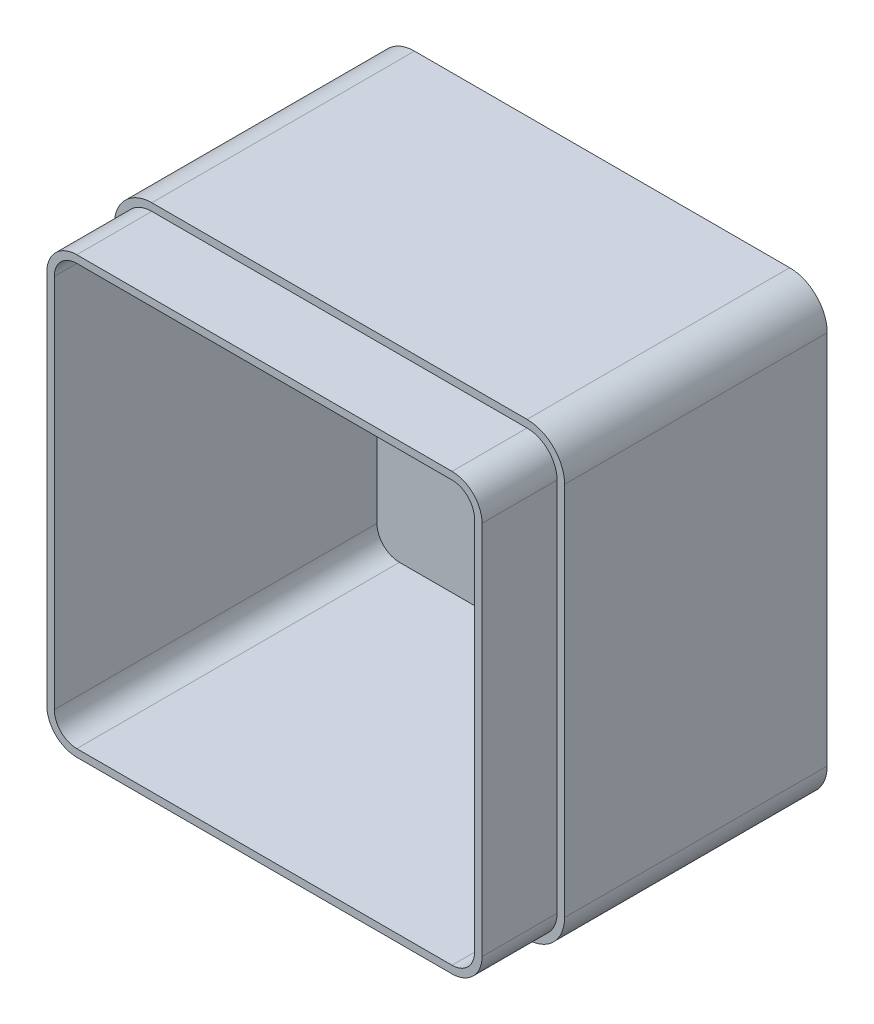
ISO-10303-21;
HEADER;
FILE_DESCRIPTION(('STEP AP214'),'2;1');
FILE_NAME('part.step','',(''),(''),'','','');
FILE_SCHEMA(('AUTOMOTIVE_DESIGN { 1 0 10303 214 1 1 1 1 }'));
ENDSEC;
DATA;
#1=APPLICATION_CONTEXT('core data for automotive mechanical design processes');
#2=APPLICATION_PROTOCOL_DEFINITION('international standard','automotive_design',2000,#1);
#3=PRODUCT_CONTEXT('',#1,'mechanical');
#4=PRODUCT('Part','Part','',(#3));
#5=PRODUCT_RELATED_PRODUCT_CATEGORY('part','',(#4));
#6=PRODUCT_DEFINITION_FORMATION('','',#4);
#7=PRODUCT_DEFINITION_CONTEXT('part definition',#1,'design');
#8=PRODUCT_DEFINITION('design','',#6,#7);
#9=PRODUCT_DEFINITION_SHAPE('','',#8);
#10=(LENGTH_UNIT() NAMED_UNIT(*) SI_UNIT(.MILLI.,.METRE.));
#11=(NAMED_UNIT(*) PLANE_ANGLE_UNIT() SI_UNIT($,.RADIAN.));
#12=(NAMED_UNIT(*) SI_UNIT($,.STERADIAN.) SOLID_ANGLE_UNIT());
#13=UNCERTAINTY_MEASURE_WITH_UNIT(LENGTH_MEASURE(1.E-05),#10,'distance_accuracy_value','');
#14=(GEOMETRIC_REPRESENTATION_CONTEXT(3) GLOBAL_UNCERTAINTY_ASSIGNED_CONTEXT((#13)) GLOBAL_UNIT_ASSIGNED_CONTEXT((#10,
#11,#12)) REPRESENTATION_CONTEXT('',''));
#15=CARTESIAN_POINT('',(0.,0.,0.));
#16=DIRECTION('',(0.,0.,1.));
#17=DIRECTION('',(1.,0.,0.));
#18=AXIS2_PLACEMENT_3D('',#15,#16,#17);
#19=CARTESIAN_POINT('',(0.,0.,90.));
#20=DIRECTION('',(0.,0.,-1.));
#21=DIRECTION('',(-1.,0.,0.));
#22=AXIS2_PLACEMENT_3D('',#19,#20,#21);
#23=PLANE('',#22);
#24=DIRECTION('',(-1.,0.,0.));
#25=VECTOR('',#24,1.);
#26=CARTESIAN_POINT('',(0.,56.,90.));
#27=LINE('',#26,#25);
#28=CARTESIAN_POINT('',(50.,56.,90.));
#29=VERTEX_POINT('',#28);
#30=CARTESIAN_POINT('',(-50.,56.,90.));
#31=VERTEX_POINT('',#30);
#32=EDGE_CURVE('E377',#29,#31,#27,.T.);
#33=ORIENTED_EDGE('',*,*,#32,.F.);
#34=CARTESIAN_POINT('',(50.,50.,90.));
#35=DIRECTION('',(0.,0.,-1.));
#36=DIRECTION('',(-1.,0.,0.));
#37=AXIS2_PLACEMENT_3D('',#34,#35,#36);
#38=CIRCLE('',#37,6.);
#39=CARTESIAN_POINT('',(56.,50.,90.));
#40=VERTEX_POINT('',#39);
#41=EDGE_CURVE('E357',#40,#29,#38,.F.);
#42=ORIENTED_EDGE('',*,*,#41,.F.);
#43=DIRECTION('',(0.,1.,0.));
#44=VECTOR('',#43,1.);
#45=CARTESIAN_POINT('',(56.,0.,90.));
#46=LINE('',#45,#44);
#47=CARTESIAN_POINT('',(56.,-50.,90.));
#48=VERTEX_POINT('',#47);
#49=EDGE_CURVE('E351',#48,#40,#46,.T.);
#50=ORIENTED_EDGE('',*,*,#49,.F.);
#51=CARTESIAN_POINT('',(50.,-50.,90.));
#52=DIRECTION('',(0.,0.,-1.));
#53=DIRECTION('',(-1.,0.,0.));
#54=AXIS2_PLACEMENT_3D('',#51,#52,#53);
#55=CIRCLE('',#54,6.);
#56=CARTESIAN_POINT('',(50.,-56.,90.));
#57=VERTEX_POINT('',#56);
#58=EDGE_CURVE('E380',#57,#48,#55,.F.);
#59=ORIENTED_EDGE('',*,*,#58,.F.);
#60=DIRECTION('',(1.,0.,0.));
#61=VECTOR('',#60,1.);
#62=CARTESIAN_POINT('',(0.,-56.,90.));
#63=LINE('',#62,#61);
#64=CARTESIAN_POINT('',(-50.,-56.,90.));
#65=VERTEX_POINT('',#64);
#66=EDGE_CURVE('E367',#65,#57,#63,.T.);
#67=ORIENTED_EDGE('',*,*,#66,.F.);
#68=CARTESIAN_POINT('',(-50.,-50.,90.));
#69=DIRECTION('',(0.,0.,-1.));
#70=DIRECTION('',(-1.,0.,0.));
#71=AXIS2_PLACEMENT_3D('',#68,#69,#70);
#72=CIRCLE('',#71,6.);
#73=CARTESIAN_POINT('',(-56.,-50.,90.));
#74=VERTEX_POINT('',#73);
#75=EDGE_CURVE('E387',#74,#65,#72,.F.);
#76=ORIENTED_EDGE('',*,*,#75,.F.);
#77=DIRECTION('',(0.,-1.,0.));
#78=VECTOR('',#77,1.);
#79=CARTESIAN_POINT('',(-56.,0.,90.));
#80=LINE('',#79,#78);
#81=CARTESIAN_POINT('',(-56.,50.,90.));
#82=VERTEX_POINT('',#81);
#83=EDGE_CURVE('E384',#82,#74,#80,.T.);
#84=ORIENTED_EDGE('',*,*,#83,.F.);
#85=CARTESIAN_POINT('',(-50.,50.,90.));
#86=DIRECTION('',(0.,0.,-1.));
#87=DIRECTION('',(-1.,0.,0.));
#88=AXIS2_PLACEMENT_3D('',#85,#86,#87);
#89=CIRCLE('',#88,6.);
#90=EDGE_CURVE('E374',#31,#82,#89,.F.);
#91=ORIENTED_EDGE('',*,*,#90,.F.);
#92=EDGE_LOOP('',(#33,#42,#50,#59,#67,#76,#84,#91));
#93=FACE_BOUND('',#92,.T.);
#94=CARTESIAN_POINT('',(50.,50.,90.));
#95=DIRECTION('',(0.,0.,1.));
#96=DIRECTION('',(1.,0.,0.));
#97=AXIS2_PLACEMENT_3D('',#94,#95,#96);
#98=CIRCLE('',#97,8.);
#99=CARTESIAN_POINT('',(58.,50.,90.));
#100=VERTEX_POINT('',#99);
#101=CARTESIAN_POINT('',(50.,58.,90.));
#102=VERTEX_POINT('',#101);
#103=EDGE_CURVE('E54',#100,#102,#98,.T.);
#104=ORIENTED_EDGE('',*,*,#103,.T.);
#105=DIRECTION('',(-1.,0.,0.));
#106=VECTOR('',#105,1.);
#107=CARTESIAN_POINT('',(0.,58.,90.));
#108=LINE('',#107,#106);
#109=CARTESIAN_POINT('',(-50.,58.,90.));
#110=VERTEX_POINT('',#109);
#111=EDGE_CURVE('E223',#102,#110,#108,.T.);
#112=ORIENTED_EDGE('',*,*,#111,.T.);
#113=CARTESIAN_POINT('',(-50.,50.,90.));
#114=DIRECTION('',(0.,0.,1.));
#115=DIRECTION('',(1.,0.,0.));
#116=AXIS2_PLACEMENT_3D('',#113,#114,#115);
#117=CIRCLE('',#116,7.99999999999999);
#118=CARTESIAN_POINT('',(-58.,50.,90.));
#119=VERTEX_POINT('',#118);
#120=EDGE_CURVE('E227',#110,#119,#117,.T.);
#121=ORIENTED_EDGE('',*,*,#120,.T.);
#122=DIRECTION('',(0.,-1.,0.));
#123=VECTOR('',#122,1.);
#124=CARTESIAN_POINT('',(-58.,0.,90.));
#125=LINE('',#124,#123);
#126=CARTESIAN_POINT('',(-58.,-50.,90.));
#127=VERTEX_POINT('',#126);
#128=EDGE_CURVE('E286',#119,#127,#125,.T.);
#129=ORIENTED_EDGE('',*,*,#128,.T.);
#130=CARTESIAN_POINT('',(-50.,-50.,90.));
#131=DIRECTION('',(0.,0.,1.));
#132=DIRECTION('',(1.,0.,0.));
#133=AXIS2_PLACEMENT_3D('',#130,#131,#132);
#134=CIRCLE('',#133,8.);
#135=CARTESIAN_POINT('',(-50.,-58.,90.));
#136=VERTEX_POINT('',#135);
#137=EDGE_CURVE('E282',#127,#136,#134,.T.);
#138=ORIENTED_EDGE('',*,*,#137,.T.);
#139=DIRECTION('',(1.,0.,0.));
#140=VECTOR('',#139,1.);
#141=CARTESIAN_POINT('',(0.,-58.,90.));
#142=LINE('',#141,#140);
#143=CARTESIAN_POINT('',(50.,-58.,90.));
#144=VERTEX_POINT('',#143);
#145=EDGE_CURVE('E278',#136,#144,#142,.T.);
#146=ORIENTED_EDGE('',*,*,#145,.T.);
#147=CARTESIAN_POINT('',(50.,-50.,90.));
#148=DIRECTION('',(0.,0.,1.));
#149=DIRECTION('',(1.,0.,0.));
#150=AXIS2_PLACEMENT_3D('',#147,#148,#149);
#151=CIRCLE('',#150,8.);
#152=CARTESIAN_POINT('',(58.,-50.,90.));
#153=VERTEX_POINT('',#152);
#154=EDGE_CURVE('E274',#144,#153,#151,.T.);
#155=ORIENTED_EDGE('',*,*,#154,.T.);
#156=DIRECTION('',(0.,1.,0.));
#157=VECTOR('',#156,1.);
#158=CARTESIAN_POINT('',(58.,0.,90.));
#159=LINE('',#158,#157);
#160=EDGE_CURVE('E271',#153,#100,#159,.T.);
#161=ORIENTED_EDGE('',*,*,#160,.T.);
#162=EDGE_LOOP('',(#104,#112,#121,#129,#138,#146,#155,#161));
#163=FACE_BOUND('',#162,.T.);
#164=ADVANCED_FACE('F38',(#93,#163),#23,.F.);
#165=CARTESIAN_POINT('',(56.,-60.,90.));
#166=DIRECTION('',(-1.,0.,0.));
#167=DIRECTION('',(0.,0.,1.));
#168=AXIS2_PLACEMENT_3D('',#165,#166,#167);
#169=PLANE('',#168);
#170=ORIENTED_EDGE('',*,*,#49,.T.);
#171=DIRECTION('',(0.,0.,1.));
#172=VECTOR('',#171,1.);
#173=CARTESIAN_POINT('',(56.,50.,90.));
#174=LINE('',#173,#172);
#175=CARTESIAN_POINT('',(56.,50.,4.));
#176=VERTEX_POINT('',#175);
#177=EDGE_CURVE('E319',#176,#40,#174,.T.);
#178=ORIENTED_EDGE('',*,*,#177,.F.);
#179=DIRECTION('',(0.,1.,0.));
#180=VECTOR('',#179,1.);
#181=CARTESIAN_POINT('',(56.,0.,4.));
#182=LINE('',#181,#180);
#183=CARTESIAN_POINT('',(56.,-50.,4.));
#184=VERTEX_POINT('',#183);
#185=EDGE_CURVE('E296',#184,#176,#182,.T.);
#186=ORIENTED_EDGE('',*,*,#185,.F.);
#187=DIRECTION('',(0.,0.,1.));
#188=VECTOR('',#187,1.);
#189=CARTESIAN_POINT('',(56.,-50.,90.));
#190=LINE('',#189,#188);
#191=EDGE_CURVE('E314',#48,#184,#190,.F.);
#192=ORIENTED_EDGE('',*,*,#191,.F.);
#193=EDGE_LOOP('',(#170,#178,#186,#192));
#194=FACE_BOUND('',#193,.T.);
#195=ADVANCED_FACE('F497',(#194),#169,.T.);
#196=CARTESIAN_POINT('',(-60.,56.,90.));
#197=DIRECTION('',(0.,-1.,0.));
#198=DIRECTION('',(0.,0.,-1.));
#199=AXIS2_PLACEMENT_3D('',#196,#197,#198);
#200=PLANE('',#199);
#201=DIRECTION('',(-1.,0.,0.));
#202=VECTOR('',#201,1.);
#203=CARTESIAN_POINT('',(0.,56.,4.));
#204=LINE('',#203,#202);
#205=CARTESIAN_POINT('',(50.,56.,4.));
#206=VERTEX_POINT('',#205);
#207=CARTESIAN_POINT('',(-50.,56.,4.));
#208=VERTEX_POINT('',#207);
#209=EDGE_CURVE('E323',#206,#208,#204,.T.);
#210=ORIENTED_EDGE('',*,*,#209,.F.);
#211=DIRECTION('',(0.,0.,-1.));
#212=VECTOR('',#211,1.);
#213=CARTESIAN_POINT('',(50.,56.,90.));
#214=LINE('',#213,#212);
#215=EDGE_CURVE('E336',#29,#206,#214,.T.);
#216=ORIENTED_EDGE('',*,*,#215,.F.);
#217=ORIENTED_EDGE('',*,*,#32,.T.);
#218=DIRECTION('',(0.,0.,-1.));
#219=VECTOR('',#218,1.);
#220=CARTESIAN_POINT('',(-50.,56.,90.));
#221=LINE('',#220,#219);
#222=EDGE_CURVE('E354',#208,#31,#221,.F.);
#223=ORIENTED_EDGE('',*,*,#222,.F.);
#224=EDGE_LOOP('',(#210,#216,#217,#223));
#225=FACE_BOUND('',#224,.T.);
#226=ADVANCED_FACE('F503',(#225),#200,.T.);
#227=CARTESIAN_POINT('',(-56.,-60.,90.));
#228=DIRECTION('',(1.,0.,0.));
#229=DIRECTION('',(0.,0.,-1.));
#230=AXIS2_PLACEMENT_3D('',#227,#228,#229);
#231=PLANE('',#230);
#232=ORIENTED_EDGE('',*,*,#83,.T.);
#233=DIRECTION('',(0.,0.,-1.));
#234=VECTOR('',#233,1.);
#235=CARTESIAN_POINT('',(-56.,-50.,90.));
#236=LINE('',#235,#234);
#237=CARTESIAN_POINT('',(-56.,-50.,4.));
#238=VERTEX_POINT('',#237);
#239=EDGE_CURVE('E364',#238,#74,#236,.F.);
#240=ORIENTED_EDGE('',*,*,#239,.F.);
#241=DIRECTION('',(0.,-1.,0.));
#242=VECTOR('',#241,1.);
#243=CARTESIAN_POINT('',(-56.,0.,4.));
#244=LINE('',#243,#242);
#245=CARTESIAN_POINT('',(-56.,50.,4.));
#246=VERTEX_POINT('',#245);
#247=EDGE_CURVE('E328',#246,#238,#244,.T.);
#248=ORIENTED_EDGE('',*,*,#247,.F.);
#249=DIRECTION('',(0.,0.,-1.));
#250=VECTOR('',#249,1.);
#251=CARTESIAN_POINT('',(-56.,50.,90.));
#252=LINE('',#251,#250);
#253=EDGE_CURVE('E345',#82,#246,#252,.T.);
#254=ORIENTED_EDGE('',*,*,#253,.F.);
#255=EDGE_LOOP('',(#232,#240,#248,#254));
#256=FACE_BOUND('',#255,.T.);
#257=ADVANCED_FACE('F532',(#256),#231,.T.);
#258=CARTESIAN_POINT('',(-60.,-56.,90.));
#259=DIRECTION('',(0.,1.,0.));
#260=DIRECTION('',(0.,0.,1.));
#261=AXIS2_PLACEMENT_3D('',#258,#259,#260);
#262=PLANE('',#261);
#263=ORIENTED_EDGE('',*,*,#66,.T.);
#264=DIRECTION('',(0.,0.,1.));
#265=VECTOR('',#264,1.);
#266=CARTESIAN_POINT('',(50.,-56.,90.));
#267=LINE('',#266,#265);
#268=CARTESIAN_POINT('',(50.,-56.,4.));
#269=VERTEX_POINT('',#268);
#270=EDGE_CURVE('E371',#269,#57,#267,.T.);
#271=ORIENTED_EDGE('',*,*,#270,.F.);
#272=DIRECTION('',(1.,0.,0.));
#273=VECTOR('',#272,1.);
#274=CARTESIAN_POINT('',(0.,-56.,4.));
#275=LINE('',#274,#273);
#276=CARTESIAN_POINT('',(-50.,-56.,4.));
#277=VERTEX_POINT('',#276);
#278=EDGE_CURVE('E332',#277,#269,#275,.T.);
#279=ORIENTED_EDGE('',*,*,#278,.F.);
#280=DIRECTION('',(0.,0.,1.));
#281=VECTOR('',#280,1.);
#282=CARTESIAN_POINT('',(-50.,-56.,90.));
#283=LINE('',#282,#281);
#284=EDGE_CURVE('E327',#65,#277,#283,.F.);
#285=ORIENTED_EDGE('',*,*,#284,.F.);
#286=EDGE_LOOP('',(#263,#271,#279,#285));
#287=FACE_BOUND('',#286,.T.);
#288=ADVANCED_FACE('F528',(#287),#262,.T.);
#289=CARTESIAN_POINT('',(0.,0.,4.));
#290=DIRECTION('',(0.,0.,-1.));
#291=DIRECTION('',(-1.,0.,0.));
#292=AXIS2_PLACEMENT_3D('',#289,#290,#291);
#293=PLANE('',#292);
#294=ORIENTED_EDGE('',*,*,#247,.T.);
#295=CARTESIAN_POINT('',(-50.,-50.,4.));
#296=DIRECTION('',(0.,0.,-1.));
#297=DIRECTION('',(-1.,0.,0.));
#298=AXIS2_PLACEMENT_3D('',#295,#296,#297);
#299=CIRCLE('',#298,6.);
#300=EDGE_CURVE('E337',#277,#238,#299,.T.);
#301=ORIENTED_EDGE('',*,*,#300,.F.);
#302=ORIENTED_EDGE('',*,*,#278,.T.);
#303=CARTESIAN_POINT('',(50.,-50.,4.));
#304=DIRECTION('',(0.,0.,-1.));
#305=DIRECTION('',(-1.,0.,0.));
#306=AXIS2_PLACEMENT_3D('',#303,#304,#305);
#307=CIRCLE('',#306,6.);
#308=EDGE_CURVE('E344',#184,#269,#307,.T.);
#309=ORIENTED_EDGE('',*,*,#308,.F.);
#310=ORIENTED_EDGE('',*,*,#185,.T.);
#311=CARTESIAN_POINT('',(50.,50.,4.));
#312=DIRECTION('',(0.,0.,-1.));
#313=DIRECTION('',(-1.,0.,0.));
#314=AXIS2_PLACEMENT_3D('',#311,#312,#313);
#315=CIRCLE('',#314,6.);
#316=EDGE_CURVE('E341',#206,#176,#315,.T.);
#317=ORIENTED_EDGE('',*,*,#316,.F.);
#318=ORIENTED_EDGE('',*,*,#209,.T.);
#319=CARTESIAN_POINT('',(-50.,50.,4.));
#320=DIRECTION('',(0.,0.,-1.));
#321=DIRECTION('',(-1.,0.,0.));
#322=AXIS2_PLACEMENT_3D('',#319,#320,#321);
#323=CIRCLE('',#322,6.);
#324=EDGE_CURVE('E333',#246,#208,#323,.T.);
#325=ORIENTED_EDGE('',*,*,#324,.F.);
#326=EDGE_LOOP('',(#294,#301,#302,#309,#310,#317,#318,#325));
#327=FACE_BOUND('',#326,.T.);
#328=ADVANCED_FACE('F524',(#327),#293,.F.);
#329=CARTESIAN_POINT('',(-50.,50.,90.));
#330=DIRECTION('',(0.,0.,-1.));
#331=DIRECTION('',(-1.,0.,0.));
#332=AXIS2_PLACEMENT_3D('',#329,#330,#331);
#333=CYLINDRICAL_SURFACE('',#332,6.);
#334=ORIENTED_EDGE('',*,*,#90,.T.);
#335=ORIENTED_EDGE('',*,*,#253,.T.);
#336=ORIENTED_EDGE('',*,*,#324,.T.);
#337=ORIENTED_EDGE('',*,*,#222,.T.);
#338=EDGE_LOOP('',(#334,#335,#336,#337));
#339=FACE_BOUND('',#338,.T.);
#340=ADVANCED_FACE('F520',(#339),#333,.F.);
#341=CARTESIAN_POINT('',(-50.,-50.,90.));
#342=DIRECTION('',(0.,0.,-1.));
#343=DIRECTION('',(-1.,0.,0.));
#344=AXIS2_PLACEMENT_3D('',#341,#342,#343);
#345=CYLINDRICAL_SURFACE('',#344,6.);
#346=ORIENTED_EDGE('',*,*,#75,.T.);
#347=ORIENTED_EDGE('',*,*,#284,.T.);
#348=ORIENTED_EDGE('',*,*,#300,.T.);
#349=ORIENTED_EDGE('',*,*,#239,.T.);
#350=EDGE_LOOP('',(#346,#347,#348,#349));
#351=FACE_BOUND('',#350,.T.);
#352=ADVANCED_FACE('F516',(#351),#345,.F.);
#353=CARTESIAN_POINT('',(50.,-50.,90.));
#354=DIRECTION('',(0.,0.,-1.));
#355=DIRECTION('',(-1.,0.,0.));
#356=AXIS2_PLACEMENT_3D('',#353,#354,#355);
#357=CYLINDRICAL_SURFACE('',#356,6.);
#358=ORIENTED_EDGE('',*,*,#58,.T.);
#359=ORIENTED_EDGE('',*,*,#191,.T.);
#360=ORIENTED_EDGE('',*,*,#308,.T.);
#361=ORIENTED_EDGE('',*,*,#270,.T.);
#362=EDGE_LOOP('',(#358,#359,#360,#361));
#363=FACE_BOUND('',#362,.T.);
#364=ADVANCED_FACE('F512',(#363),#357,.F.);
#365=CARTESIAN_POINT('',(50.,50.,90.));
#366=DIRECTION('',(0.,0.,-1.));
#367=DIRECTION('',(-1.,0.,0.));
#368=AXIS2_PLACEMENT_3D('',#365,#366,#367);
#369=CYLINDRICAL_SURFACE('',#368,6.);
#370=ORIENTED_EDGE('',*,*,#41,.T.);
#371=ORIENTED_EDGE('',*,*,#215,.T.);
#372=ORIENTED_EDGE('',*,*,#316,.T.);
#373=ORIENTED_EDGE('',*,*,#177,.T.);
#374=EDGE_LOOP('',(#370,#371,#372,#373));
#375=FACE_BOUND('',#374,.T.);
#376=ADVANCED_FACE('F509',(#375),#369,.F.);
#377=CARTESIAN_POINT('',(50.,50.,70.));
#378=DIRECTION('',(0.,0.,1.));
#379=DIRECTION('',(1.,0.,0.));
#380=AXIS2_PLACEMENT_3D('',#377,#378,#379);
#381=CYLINDRICAL_SURFACE('',#380,8.);
#382=ORIENTED_EDGE('',*,*,#103,.F.);
#383=DIRECTION('',(0.,0.,1.));
#384=VECTOR('',#383,1.);
#385=CARTESIAN_POINT('',(58.,50.,70.));
#386=LINE('',#385,#384);
#387=CARTESIAN_POINT('',(58.,50.,70.));
#388=VERTEX_POINT('',#387);
#389=EDGE_CURVE('E204',#388,#100,#386,.T.);
#390=ORIENTED_EDGE('',*,*,#389,.F.);
#391=CARTESIAN_POINT('',(50.,50.,70.));
#392=DIRECTION('',(0.,0.,1.));
#393=DIRECTION('',(1.,0.,0.));
#394=AXIS2_PLACEMENT_3D('',#391,#392,#393);
#395=CIRCLE('',#394,8.);
#396=CARTESIAN_POINT('',(50.,58.,70.));
#397=VERTEX_POINT('',#396);
#398=EDGE_CURVE('E212',#388,#397,#395,.T.);
#399=ORIENTED_EDGE('',*,*,#398,.T.);
#400=DIRECTION('',(0.,0.,1.));
#401=VECTOR('',#400,1.);
#402=CARTESIAN_POINT('',(50.,58.,70.));
#403=LINE('',#402,#401);
#404=EDGE_CURVE('E293',#397,#102,#403,.T.);
#405=ORIENTED_EDGE('',*,*,#404,.T.);
#406=EDGE_LOOP('',(#382,#390,#399,#405));
#407=FACE_BOUND('',#406,.T.);
#408=ADVANCED_FACE('F215',(#407),#381,.T.);
#409=CARTESIAN_POINT('',(0.,58.,70.));
#410=DIRECTION('',(0.,1.,0.));
#411=DIRECTION('',(0.,0.,1.));
#412=AXIS2_PLACEMENT_3D('',#409,#410,#411);
#413=PLANE('',#412);
#414=ORIENTED_EDGE('',*,*,#111,.F.);
#415=ORIENTED_EDGE('',*,*,#404,.F.);
#416=DIRECTION('',(-1.,0.,0.));
#417=VECTOR('',#416,1.);
#418=CARTESIAN_POINT('',(0.,58.,70.));
#419=LINE('',#418,#417);
#420=CARTESIAN_POINT('',(-50.,58.,70.));
#421=VERTEX_POINT('',#420);
#422=EDGE_CURVE('E221',#397,#421,#419,.T.);
#423=ORIENTED_EDGE('',*,*,#422,.T.);
#424=DIRECTION('',(0.,0.,1.));
#425=VECTOR('',#424,1.);
#426=CARTESIAN_POINT('',(-50.,58.,70.));
#427=LINE('',#426,#425);
#428=EDGE_CURVE('E297',#421,#110,#427,.T.);
#429=ORIENTED_EDGE('',*,*,#428,.T.);
#430=EDGE_LOOP('',(#414,#415,#423,#429));
#431=FACE_BOUND('',#430,.T.);
#432=ADVANCED_FACE('F542',(#431),#413,.T.);
#433=CARTESIAN_POINT('',(-50.,50.,70.));
#434=DIRECTION('',(0.,0.,1.));
#435=DIRECTION('',(1.,0.,0.));
#436=AXIS2_PLACEMENT_3D('',#433,#434,#435);
#437=CYLINDRICAL_SURFACE('',#436,7.99999999999999);
#438=ORIENTED_EDGE('',*,*,#120,.F.);
#439=ORIENTED_EDGE('',*,*,#428,.F.);
#440=CARTESIAN_POINT('',(-50.,50.,70.));
#441=DIRECTION('',(0.,0.,1.));
#442=DIRECTION('',(1.,0.,0.));
#443=AXIS2_PLACEMENT_3D('',#440,#441,#442);
#444=CIRCLE('',#443,7.99999999999999);
#445=CARTESIAN_POINT('',(-58.,50.,70.));
#446=VERTEX_POINT('',#445);
#447=EDGE_CURVE('E241',#421,#446,#444,.T.);
#448=ORIENTED_EDGE('',*,*,#447,.T.);
#449=DIRECTION('',(0.,0.,1.));
#450=VECTOR('',#449,1.);
#451=CARTESIAN_POINT('',(-58.,50.,70.));
#452=LINE('',#451,#450);
#453=EDGE_CURVE('E300',#446,#119,#452,.T.);
#454=ORIENTED_EDGE('',*,*,#453,.T.);
#455=EDGE_LOOP('',(#438,#439,#448,#454));
#456=FACE_BOUND('',#455,.T.);
#457=ADVANCED_FACE('F560',(#456),#437,.T.);
#458=CARTESIAN_POINT('',(-58.,0.,70.));
#459=DIRECTION('',(-1.,0.,0.));
#460=DIRECTION('',(0.,0.,1.));
#461=AXIS2_PLACEMENT_3D('',#458,#459,#460);
#462=PLANE('',#461);
#463=ORIENTED_EDGE('',*,*,#128,.F.);
#464=ORIENTED_EDGE('',*,*,#453,.F.);
#465=DIRECTION('',(0.,-1.,0.));
#466=VECTOR('',#465,1.);
#467=CARTESIAN_POINT('',(-58.,0.,70.));
#468=LINE('',#467,#466);
#469=CARTESIAN_POINT('',(-58.,-50.,70.));
#470=VERTEX_POINT('',#469);
#471=EDGE_CURVE('E238',#446,#470,#468,.T.);
#472=ORIENTED_EDGE('',*,*,#471,.T.);
#473=DIRECTION('',(0.,0.,1.));
#474=VECTOR('',#473,1.);
#475=CARTESIAN_POINT('',(-58.,-50.,70.));
#476=LINE('',#475,#474);
#477=EDGE_CURVE('E303',#470,#127,#476,.T.);
#478=ORIENTED_EDGE('',*,*,#477,.T.);
#479=EDGE_LOOP('',(#463,#464,#472,#478));
#480=FACE_BOUND('',#479,.T.);
#481=ADVANCED_FACE('F556',(#480),#462,.T.);
#482=CARTESIAN_POINT('',(-50.,-50.,70.));
#483=DIRECTION('',(0.,0.,1.));
#484=DIRECTION('',(1.,0.,0.));
#485=AXIS2_PLACEMENT_3D('',#482,#483,#484);
#486=CYLINDRICAL_SURFACE('',#485,8.);
#487=ORIENTED_EDGE('',*,*,#137,.F.);
#488=ORIENTED_EDGE('',*,*,#477,.F.);
#489=CARTESIAN_POINT('',(-50.,-50.,70.));
#490=DIRECTION('',(0.,0.,1.));
#491=DIRECTION('',(1.,0.,0.));
#492=AXIS2_PLACEMENT_3D('',#489,#490,#491);
#493=CIRCLE('',#492,8.);
#494=CARTESIAN_POINT('',(-50.,-58.,70.));
#495=VERTEX_POINT('',#494);
#496=EDGE_CURVE('E235',#470,#495,#493,.T.);
#497=ORIENTED_EDGE('',*,*,#496,.T.);
#498=DIRECTION('',(0.,0.,1.));
#499=VECTOR('',#498,1.);
#500=CARTESIAN_POINT('',(-50.,-58.,70.));
#501=LINE('',#500,#499);
#502=EDGE_CURVE('E306',#495,#136,#501,.T.);
#503=ORIENTED_EDGE('',*,*,#502,.T.);
#504=EDGE_LOOP('',(#487,#488,#497,#503));
#505=FACE_BOUND('',#504,.T.);
#506=ADVANCED_FACE('F552',(#505),#486,.T.);
#507=CARTESIAN_POINT('',(0.,-58.,70.));
#508=DIRECTION('',(0.,-1.,0.));
#509=DIRECTION('',(0.,0.,-1.));
#510=AXIS2_PLACEMENT_3D('',#507,#508,#509);
#511=PLANE('',#510);
#512=ORIENTED_EDGE('',*,*,#145,.F.);
#513=ORIENTED_EDGE('',*,*,#502,.F.);
#514=DIRECTION('',(1.,0.,0.));
#515=VECTOR('',#514,1.);
#516=CARTESIAN_POINT('',(0.,-58.,70.));
#517=LINE('',#516,#515);
#518=CARTESIAN_POINT('',(50.,-58.,70.));
#519=VERTEX_POINT('',#518);
#520=EDGE_CURVE('E232',#495,#519,#517,.T.);
#521=ORIENTED_EDGE('',*,*,#520,.T.);
#522=DIRECTION('',(0.,0.,1.));
#523=VECTOR('',#522,1.);
#524=CARTESIAN_POINT('',(50.,-58.,70.));
#525=LINE('',#524,#523);
#526=EDGE_CURVE('E309',#519,#144,#525,.T.);
#527=ORIENTED_EDGE('',*,*,#526,.T.);
#528=EDGE_LOOP('',(#512,#513,#521,#527));
#529=FACE_BOUND('',#528,.T.);
#530=ADVANCED_FACE('F548',(#529),#511,.T.);
#531=CARTESIAN_POINT('',(50.,-50.,70.));
#532=DIRECTION('',(0.,0.,1.));
#533=DIRECTION('',(1.,0.,0.));
#534=AXIS2_PLACEMENT_3D('',#531,#532,#533);
#535=CYLINDRICAL_SURFACE('',#534,8.);
#536=ORIENTED_EDGE('',*,*,#154,.F.);
#537=ORIENTED_EDGE('',*,*,#526,.F.);
#538=CARTESIAN_POINT('',(50.,-50.,70.));
#539=DIRECTION('',(0.,0.,1.));
#540=DIRECTION('',(1.,0.,0.));
#541=AXIS2_PLACEMENT_3D('',#538,#539,#540);
#542=CIRCLE('',#541,8.);
#543=CARTESIAN_POINT('',(58.,-50.,70.));
#544=VERTEX_POINT('',#543);
#545=EDGE_CURVE('E211',#519,#544,#542,.T.);
#546=ORIENTED_EDGE('',*,*,#545,.T.);
#547=DIRECTION('',(0.,0.,1.));
#548=VECTOR('',#547,1.);
#549=CARTESIAN_POINT('',(58.,-50.,70.));
#550=LINE('',#549,#548);
#551=EDGE_CURVE('E206',#544,#153,#550,.T.);
#552=ORIENTED_EDGE('',*,*,#551,.T.);
#553=EDGE_LOOP('',(#536,#537,#546,#552));
#554=FACE_BOUND('',#553,.T.);
#555=ADVANCED_FACE('F545',(#554),#535,.T.);
#556=CARTESIAN_POINT('',(58.,0.,70.));
#557=DIRECTION('',(1.,0.,0.));
#558=DIRECTION('',(0.,0.,-1.));
#559=AXIS2_PLACEMENT_3D('',#556,#557,#558);
#560=PLANE('',#559);
#561=ORIENTED_EDGE('',*,*,#160,.F.);
#562=ORIENTED_EDGE('',*,*,#551,.F.);
#563=DIRECTION('',(0.,1.,0.));
#564=VECTOR('',#563,1.);
#565=CARTESIAN_POINT('',(58.,0.,70.));
#566=LINE('',#565,#564);
#567=EDGE_CURVE('E201',#544,#388,#566,.T.);
#568=ORIENTED_EDGE('',*,*,#567,.T.);
#569=ORIENTED_EDGE('',*,*,#389,.T.);
#570=EDGE_LOOP('',(#561,#562,#568,#569));
#571=FACE_BOUND('',#570,.T.);
#572=ADVANCED_FACE('F203',(#571),#560,.T.);
#573=CARTESIAN_POINT('',(0.,0.,70.));
#574=DIRECTION('',(0.,0.,1.));
#575=DIRECTION('',(1.,0.,0.));
#576=AXIS2_PLACEMENT_3D('',#573,#574,#575);
#577=PLANE('',#576);
#578=ORIENTED_EDGE('',*,*,#398,.F.);
#579=ORIENTED_EDGE('',*,*,#567,.F.);
#580=ORIENTED_EDGE('',*,*,#545,.F.);
#581=ORIENTED_EDGE('',*,*,#520,.F.);
#582=ORIENTED_EDGE('',*,*,#496,.F.);
#583=ORIENTED_EDGE('',*,*,#471,.F.);
#584=ORIENTED_EDGE('',*,*,#447,.F.);
#585=ORIENTED_EDGE('',*,*,#422,.F.);
#586=EDGE_LOOP('',(#578,#579,#580,#581,#582,#583,#584,#585));
#587=FACE_BOUND('',#586,.T.);
#588=CARTESIAN_POINT('',(50.,50.,70.));
#589=DIRECTION('',(0.,0.,1.));
#590=DIRECTION('',(1.,0.,0.));
#591=AXIS2_PLACEMENT_3D('',#588,#589,#590);
#592=CIRCLE('',#591,10.);
#593=CARTESIAN_POINT('',(60.,50.,70.));
#594=VERTEX_POINT('',#593);
#595=CARTESIAN_POINT('',(50.,60.,70.));
#596=VERTEX_POINT('',#595);
#597=EDGE_CURVE('E246',#594,#596,#592,.T.);
#598=ORIENTED_EDGE('',*,*,#597,.T.);
#599=DIRECTION('',(-1.,0.,0.));
#600=VECTOR('',#599,1.);
#601=CARTESIAN_POINT('',(0.,60.,70.));
#602=LINE('',#601,#600);
#603=CARTESIAN_POINT('',(-50.,60.,70.));
#604=VERTEX_POINT('',#603);
#605=EDGE_CURVE('E249',#596,#604,#602,.T.);
#606=ORIENTED_EDGE('',*,*,#605,.T.);
#607=CARTESIAN_POINT('',(-50.,50.,70.));
#608=DIRECTION('',(0.,0.,1.));
#609=DIRECTION('',(1.,0.,0.));
#610=AXIS2_PLACEMENT_3D('',#607,#608,#609);
#611=CIRCLE('',#610,10.);
#612=CARTESIAN_POINT('',(-60.,50.,70.));
#613=VERTEX_POINT('',#612);
#614=EDGE_CURVE('E252',#604,#613,#611,.T.);
#615=ORIENTED_EDGE('',*,*,#614,.T.);
#616=DIRECTION('',(0.,-1.,0.));
#617=VECTOR('',#616,1.);
#618=CARTESIAN_POINT('',(-60.,0.,70.));
#619=LINE('',#618,#617);
#620=CARTESIAN_POINT('',(-60.,-50.,70.));
#621=VERTEX_POINT('',#620);
#622=EDGE_CURVE('E255',#613,#621,#619,.T.);
#623=ORIENTED_EDGE('',*,*,#622,.T.);
#624=CARTESIAN_POINT('',(-50.,-50.,70.));
#625=DIRECTION('',(0.,0.,1.));
#626=DIRECTION('',(1.,0.,0.));
#627=AXIS2_PLACEMENT_3D('',#624,#625,#626);
#628=CIRCLE('',#627,10.);
#629=CARTESIAN_POINT('',(-50.,-60.,70.));
#630=VERTEX_POINT('',#629);
#631=EDGE_CURVE('E258',#621,#630,#628,.T.);
#632=ORIENTED_EDGE('',*,*,#631,.T.);
#633=DIRECTION('',(1.,0.,0.));
#634=VECTOR('',#633,1.);
#635=CARTESIAN_POINT('',(0.,-60.,70.));
#636=LINE('',#635,#634);
#637=CARTESIAN_POINT('',(50.,-60.,70.));
#638=VERTEX_POINT('',#637);
#639=EDGE_CURVE('E261',#630,#638,#636,.T.);
#640=ORIENTED_EDGE('',*,*,#639,.T.);
#641=CARTESIAN_POINT('',(50.,-50.,70.));
#642=DIRECTION('',(0.,0.,1.));
#643=DIRECTION('',(1.,0.,0.));
#644=AXIS2_PLACEMENT_3D('',#641,#642,#643);
#645=CIRCLE('',#644,10.);
#646=CARTESIAN_POINT('',(60.,-50.,70.));
#647=VERTEX_POINT('',#646);
#648=EDGE_CURVE('E264',#638,#647,#645,.T.);
#649=ORIENTED_EDGE('',*,*,#648,.T.);
#650=DIRECTION('',(0.,1.,0.));
#651=VECTOR('',#650,1.);
#652=CARTESIAN_POINT('',(60.,0.,70.));
#653=LINE('',#652,#651);
#654=EDGE_CURVE('E62',#647,#594,#653,.T.);
#655=ORIENTED_EDGE('',*,*,#654,.T.);
#656=EDGE_LOOP('',(#598,#606,#615,#623,#632,#640,#649,#655));
#657=FACE_BOUND('',#656,.T.);
#658=ADVANCED_FACE('F219',(#587,#657),#577,.T.);
#659=CARTESIAN_POINT('',(0.,0.,0.));
#660=DIRECTION('',(0.,0.,-1.));
#661=DIRECTION('',(-1.,0.,0.));
#662=AXIS2_PLACEMENT_3D('',#659,#660,#661);
#663=PLANE('',#662);
#664=DIRECTION('',(0.,-1.,0.));
#665=VECTOR('',#664,1.);
#666=CARTESIAN_POINT('',(-60.,-60.,0.));
#667=LINE('',#666,#665);
#668=CARTESIAN_POINT('',(-60.,50.,0.));
#669=VERTEX_POINT('',#668);
#670=CARTESIAN_POINT('',(-60.,-50.,0.));
#671=VERTEX_POINT('',#670);
#672=EDGE_CURVE('E405',#669,#671,#667,.T.);
#673=ORIENTED_EDGE('',*,*,#672,.F.);
#674=CARTESIAN_POINT('',(-50.,50.,0.));
#675=DIRECTION('',(0.,0.,-1.));
#676=DIRECTION('',(-1.,0.,0.));
#677=AXIS2_PLACEMENT_3D('',#674,#675,#676);
#678=CIRCLE('',#677,10.);
#679=CARTESIAN_POINT('',(-50.,60.,0.));
#680=VERTEX_POINT('',#679);
#681=EDGE_CURVE('E429',#669,#680,#678,.T.);
#682=ORIENTED_EDGE('',*,*,#681,.T.);
#683=DIRECTION('',(-1.,0.,0.));
#684=VECTOR('',#683,1.);
#685=CARTESIAN_POINT('',(-60.,60.,0.));
#686=LINE('',#685,#684);
#687=CARTESIAN_POINT('',(50.,60.,0.));
#688=VERTEX_POINT('',#687);
#689=EDGE_CURVE('E401',#688,#680,#686,.T.);
#690=ORIENTED_EDGE('',*,*,#689,.F.);
#691=CARTESIAN_POINT('',(50.,50.,0.));
#692=DIRECTION('',(0.,0.,-1.));
#693=DIRECTION('',(-1.,0.,0.));
#694=AXIS2_PLACEMENT_3D('',#691,#692,#693);
#695=CIRCLE('',#694,10.);
#696=CARTESIAN_POINT('',(60.,50.,0.));
#697=VERTEX_POINT('',#696);
#698=EDGE_CURVE('E420',#688,#697,#695,.T.);
#699=ORIENTED_EDGE('',*,*,#698,.T.);
#700=DIRECTION('',(0.,1.,0.));
#701=VECTOR('',#700,1.);
#702=CARTESIAN_POINT('',(60.,-60.,0.));
#703=LINE('',#702,#701);
#704=CARTESIAN_POINT('',(60.,-50.,0.));
#705=VERTEX_POINT('',#704);
#706=EDGE_CURVE('E318',#705,#697,#703,.T.);
#707=ORIENTED_EDGE('',*,*,#706,.F.);
#708=CARTESIAN_POINT('',(50.,-50.,0.));
#709=DIRECTION('',(0.,0.,-1.));
#710=DIRECTION('',(-1.,0.,0.));
#711=AXIS2_PLACEMENT_3D('',#708,#709,#710);
#712=CIRCLE('',#711,10.);
#713=CARTESIAN_POINT('',(50.,-60.,0.));
#714=VERTEX_POINT('',#713);
#715=EDGE_CURVE('E423',#705,#714,#712,.T.);
#716=ORIENTED_EDGE('',*,*,#715,.T.);
#717=DIRECTION('',(1.,0.,0.));
#718=VECTOR('',#717,1.);
#719=CARTESIAN_POINT('',(-60.,-60.,0.));
#720=LINE('',#719,#718);
#721=CARTESIAN_POINT('',(-50.,-60.,0.));
#722=VERTEX_POINT('',#721);
#723=EDGE_CURVE('E409',#722,#714,#720,.T.);
#724=ORIENTED_EDGE('',*,*,#723,.F.);
#725=CARTESIAN_POINT('',(-50.,-50.,0.));
#726=DIRECTION('',(0.,0.,-1.));
#727=DIRECTION('',(-1.,0.,0.));
#728=AXIS2_PLACEMENT_3D('',#725,#726,#727);
#729=CIRCLE('',#728,10.);
#730=EDGE_CURVE('E426',#722,#671,#729,.T.);
#731=ORIENTED_EDGE('',*,*,#730,.T.);
#732=EDGE_LOOP('',(#673,#682,#690,#699,#707,#716,#724,#731));
#733=FACE_BOUND('',#732,.T.);
#734=ADVANCED_FACE('F485',(#733),#663,.T.);
#735=CARTESIAN_POINT('',(50.,-50.,90.));
#736=DIRECTION('',(0.,0.,-1.));
#737=DIRECTION('',(-1.,0.,0.));
#738=AXIS2_PLACEMENT_3D('',#735,#736,#737);
#739=CYLINDRICAL_SURFACE('',#738,10.);
#740=DIRECTION('',(0.,0.,-1.));
#741=VECTOR('',#740,1.);
#742=CARTESIAN_POINT('',(60.,-50.,90.));
#743=LINE('',#742,#741);
#744=EDGE_CURVE('E11',#647,#705,#743,.T.);
#745=ORIENTED_EDGE('',*,*,#744,.F.);
#746=ORIENTED_EDGE('',*,*,#648,.F.);
#747=DIRECTION('',(0.,0.,-1.));
#748=VECTOR('',#747,1.);
#749=CARTESIAN_POINT('',(50.,-60.,90.));
#750=LINE('',#749,#748);
#751=EDGE_CURVE('E439',#714,#638,#750,.F.);
#752=ORIENTED_EDGE('',*,*,#751,.F.);
#753=ORIENTED_EDGE('',*,*,#715,.F.);
#754=EDGE_LOOP('',(#745,#746,#752,#753));
#755=FACE_BOUND('',#754,.T.);
#756=ADVANCED_FACE('F483',(#755),#739,.T.);
#757=CARTESIAN_POINT('',(-50.,-50.,90.));
#758=DIRECTION('',(0.,0.,-1.));
#759=DIRECTION('',(-1.,0.,0.));
#760=AXIS2_PLACEMENT_3D('',#757,#758,#759);
#761=CYLINDRICAL_SURFACE('',#760,10.);
#762=DIRECTION('',(0.,0.,-1.));
#763=VECTOR('',#762,1.);
#764=CARTESIAN_POINT('',(-50.,-60.,90.));
#765=LINE('',#764,#763);
#766=EDGE_CURVE('E443',#630,#722,#765,.T.);
#767=ORIENTED_EDGE('',*,*,#766,.F.);
#768=ORIENTED_EDGE('',*,*,#631,.F.);
#769=DIRECTION('',(0.,0.,-1.));
#770=VECTOR('',#769,1.);
#771=CARTESIAN_POINT('',(-60.,-50.,90.));
#772=LINE('',#771,#770);
#773=EDGE_CURVE('E413',#671,#621,#772,.F.);
#774=ORIENTED_EDGE('',*,*,#773,.F.);
#775=ORIENTED_EDGE('',*,*,#730,.F.);
#776=EDGE_LOOP('',(#767,#768,#774,#775));
#777=FACE_BOUND('',#776,.T.);
#778=ADVANCED_FACE('F474',(#777),#761,.T.);
#779=CARTESIAN_POINT('',(-60.,-60.,90.));
#780=DIRECTION('',(0.,1.,0.));
#781=DIRECTION('',(0.,0.,1.));
#782=AXIS2_PLACEMENT_3D('',#779,#780,#781);
#783=PLANE('',#782);
#784=ORIENTED_EDGE('',*,*,#639,.F.);
#785=ORIENTED_EDGE('',*,*,#766,.T.);
#786=ORIENTED_EDGE('',*,*,#723,.T.);
#787=ORIENTED_EDGE('',*,*,#751,.T.);
#788=EDGE_LOOP('',(#784,#785,#786,#787));
#789=FACE_BOUND('',#788,.T.);
#790=ADVANCED_FACE('F479',(#789),#783,.F.);
#791=CARTESIAN_POINT('',(-50.,50.,90.));
#792=DIRECTION('',(0.,0.,-1.));
#793=DIRECTION('',(-1.,0.,0.));
#794=AXIS2_PLACEMENT_3D('',#791,#792,#793);
#795=CYLINDRICAL_SURFACE('',#794,10.);
#796=DIRECTION('',(0.,0.,-1.));
#797=VECTOR('',#796,1.);
#798=CARTESIAN_POINT('',(-60.,50.,90.));
#799=LINE('',#798,#797);
#800=EDGE_CURVE('E417',#613,#669,#799,.T.);
#801=ORIENTED_EDGE('',*,*,#800,.F.);
#802=ORIENTED_EDGE('',*,*,#614,.F.);
#803=DIRECTION('',(0.,0.,-1.));
#804=VECTOR('',#803,1.);
#805=CARTESIAN_POINT('',(-50.,60.,90.));
#806=LINE('',#805,#804);
#807=EDGE_CURVE('E435',#680,#604,#806,.F.);
#808=ORIENTED_EDGE('',*,*,#807,.F.);
#809=ORIENTED_EDGE('',*,*,#681,.F.);
#810=EDGE_LOOP('',(#801,#802,#808,#809));
#811=FACE_BOUND('',#810,.T.);
#812=ADVANCED_FACE('F464',(#811),#795,.T.);
#813=CARTESIAN_POINT('',(-60.,-60.,90.));
#814=DIRECTION('',(1.,0.,0.));
#815=DIRECTION('',(0.,0.,-1.));
#816=AXIS2_PLACEMENT_3D('',#813,#814,#815);
#817=PLANE('',#816);
#818=ORIENTED_EDGE('',*,*,#622,.F.);
#819=ORIENTED_EDGE('',*,*,#800,.T.);
#820=ORIENTED_EDGE('',*,*,#672,.T.);
#821=ORIENTED_EDGE('',*,*,#773,.T.);
#822=EDGE_LOOP('',(#818,#819,#820,#821));
#823=FACE_BOUND('',#822,.T.);
#824=ADVANCED_FACE('F469',(#823),#817,.F.);
#825=CARTESIAN_POINT('',(50.,50.,90.));
#826=DIRECTION('',(0.,0.,-1.));
#827=DIRECTION('',(-1.,0.,0.));
#828=AXIS2_PLACEMENT_3D('',#825,#826,#827);
#829=CYLINDRICAL_SURFACE('',#828,10.);
#830=DIRECTION('',(0.,0.,-1.));
#831=VECTOR('',#830,1.);
#832=CARTESIAN_POINT('',(50.,60.,90.));
#833=LINE('',#832,#831);
#834=EDGE_CURVE('E432',#596,#688,#833,.T.);
#835=ORIENTED_EDGE('',*,*,#834,.F.);
#836=ORIENTED_EDGE('',*,*,#597,.F.);
#837=DIRECTION('',(0.,0.,-1.));
#838=VECTOR('',#837,1.);
#839=CARTESIAN_POINT('',(60.,50.,90.));
#840=LINE('',#839,#838);
#841=EDGE_CURVE('E47',#697,#594,#840,.F.);
#842=ORIENTED_EDGE('',*,*,#841,.F.);
#843=ORIENTED_EDGE('',*,*,#698,.F.);
#844=EDGE_LOOP('',(#835,#836,#842,#843));
#845=FACE_BOUND('',#844,.T.);
#846=ADVANCED_FACE('F40',(#845),#829,.T.);
#847=CARTESIAN_POINT('',(-60.,60.,90.));
#848=DIRECTION('',(0.,-1.,0.));
#849=DIRECTION('',(0.,0.,-1.));
#850=AXIS2_PLACEMENT_3D('',#847,#848,#849);
#851=PLANE('',#850);
#852=ORIENTED_EDGE('',*,*,#605,.F.);
#853=ORIENTED_EDGE('',*,*,#834,.T.);
#854=ORIENTED_EDGE('',*,*,#689,.T.);
#855=ORIENTED_EDGE('',*,*,#807,.T.);
#856=EDGE_LOOP('',(#852,#853,#854,#855));
#857=FACE_BOUND('',#856,.T.);
#858=ADVANCED_FACE('F459',(#857),#851,.F.);
#859=CARTESIAN_POINT('',(60.,-60.,90.));
#860=DIRECTION('',(-1.,0.,0.));
#861=DIRECTION('',(0.,0.,1.));
#862=AXIS2_PLACEMENT_3D('',#859,#860,#861);
#863=PLANE('',#862);
#864=ORIENTED_EDGE('',*,*,#654,.F.);
#865=ORIENTED_EDGE('',*,*,#744,.T.);
#866=ORIENTED_EDGE('',*,*,#706,.T.);
#867=ORIENTED_EDGE('',*,*,#841,.T.);
#868=EDGE_LOOP('',(#864,#865,#866,#867));
#869=FACE_BOUND('',#868,.T.);
#870=ADVANCED_FACE('F449',(#869),#863,.F.);
#871=CLOSED_SHELL('',(#164,#195,#226,#257,#288,#328,#340,#352,#364,#376,#408,#432,#457,#481,
#506,#530,#555,#572,#658,#734,#756,#778,#790,#812,#824,#846,#858,#870));
#872=MANIFOLD_SOLID_BREP('B2',#871);
#873=ADVANCED_BREP_SHAPE_REPRESENTATION('',(#18,#872),#14);
#874=SHAPE_DEFINITION_REPRESENTATION(#9,#873);
ENDSEC;
END-ISO-10303-21;
